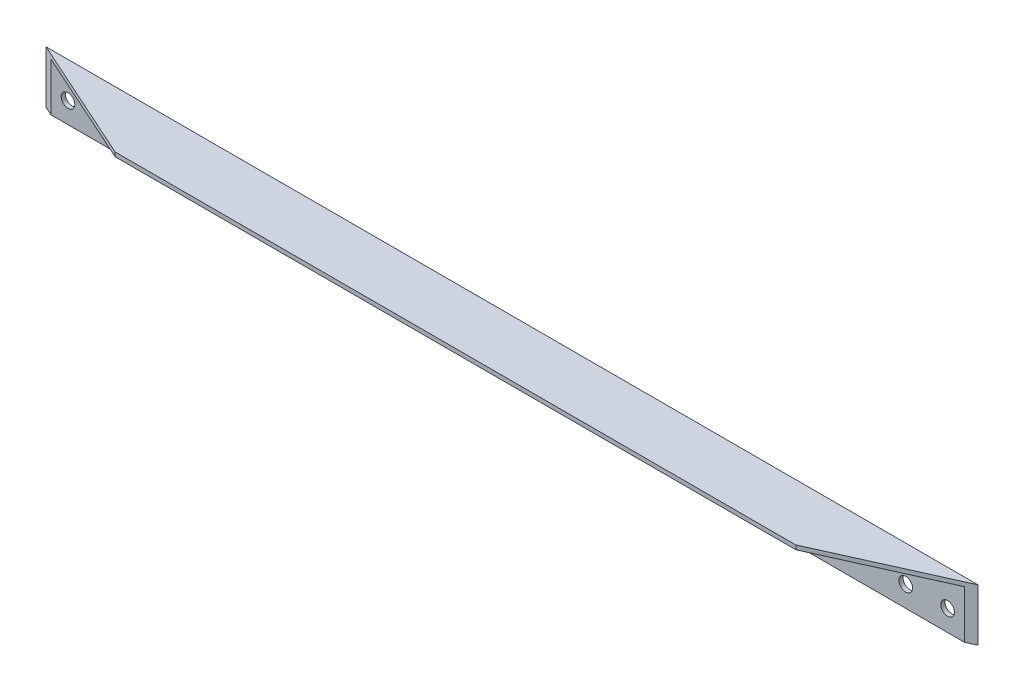
ISO-10303-21;
HEADER;
FILE_DESCRIPTION(('STEP AP214'),'2;1');
FILE_NAME('part.step','',(''),(''),'','','');
FILE_SCHEMA(('AUTOMOTIVE_DESIGN { 1 0 10303 214 1 1 1 1 }'));
ENDSEC;
DATA;
#1=APPLICATION_CONTEXT('core data for automotive mechanical design processes');
#2=APPLICATION_PROTOCOL_DEFINITION('international standard','automotive_design',2000,#1);
#3=PRODUCT_CONTEXT('',#1,'mechanical');
#4=PRODUCT('Part','Part','',(#3));
#5=PRODUCT_RELATED_PRODUCT_CATEGORY('part','',(#4));
#6=PRODUCT_DEFINITION_FORMATION('','',#4);
#7=PRODUCT_DEFINITION_CONTEXT('part definition',#1,'design');
#8=PRODUCT_DEFINITION('design','',#6,#7);
#9=PRODUCT_DEFINITION_SHAPE('','',#8);
#10=(LENGTH_UNIT() NAMED_UNIT(*) SI_UNIT(.MILLI.,.METRE.));
#11=(NAMED_UNIT(*) PLANE_ANGLE_UNIT() SI_UNIT($,.RADIAN.));
#12=(NAMED_UNIT(*) SI_UNIT($,.STERADIAN.) SOLID_ANGLE_UNIT());
#13=UNCERTAINTY_MEASURE_WITH_UNIT(LENGTH_MEASURE(1.E-05),#10,'distance_accuracy_value','');
#14=(GEOMETRIC_REPRESENTATION_CONTEXT(3) GLOBAL_UNCERTAINTY_ASSIGNED_CONTEXT((#13)) GLOBAL_UNIT_ASSIGNED_CONTEXT((#10,
#11,#12)) REPRESENTATION_CONTEXT('',''));
#15=CARTESIAN_POINT('',(0.,0.,0.));
#16=DIRECTION('',(0.,0.,1.));
#17=DIRECTION('',(1.,0.,0.));
#18=AXIS2_PLACEMENT_3D('',#15,#16,#17);
#19=CARTESIAN_POINT('',(-890.,100.,8.));
#20=DIRECTION('',(0.,0.,-1.));
#21=DIRECTION('',(-1.,0.,0.));
#22=AXIS2_PLACEMENT_3D('',#19,#20,#21);
#23=PLANE('',#22);
#24=CARTESIAN_POINT('',(-760.,39.9999999999999,8.));
#25=DIRECTION('',(0.,0.,1.));
#26=DIRECTION('',(-1.,0.,0.));
#27=AXIS2_PLACEMENT_3D('',#24,#25,#26);
#28=CIRCLE('',#27,12.9999999999998);
#29=CARTESIAN_POINT('',(-773.,39.9999999999999,8.));
#30=VERTEX_POINT('',#29);
#31=EDGE_CURVE('E105',#30,#30,#28,.T.);
#32=ORIENTED_EDGE('',*,*,#31,.F.);
#33=EDGE_LOOP('',(#32));
#34=FACE_BOUND('',#33,.T.);
#35=CARTESIAN_POINT('',(760.,39.9999999999999,8.));
#36=DIRECTION('',(0.,0.,1.));
#37=DIRECTION('',(1.,0.,0.));
#38=AXIS2_PLACEMENT_3D('',#35,#36,#37);
#39=CIRCLE('',#38,12.9999999999998);
#40=CARTESIAN_POINT('',(773.,39.9999999999999,8.));
#41=VERTEX_POINT('',#40);
#42=EDGE_CURVE('E120',#41,#41,#39,.T.);
#43=ORIENTED_EDGE('',*,*,#42,.F.);
#44=EDGE_LOOP('',(#43));
#45=FACE_BOUND('',#44,.T.);
#46=CARTESIAN_POINT('',(840.,39.9999999999999,8.));
#47=DIRECTION('',(0.,0.,1.));
#48=DIRECTION('',(1.,0.,0.));
#49=AXIS2_PLACEMENT_3D('',#46,#47,#48);
#50=CIRCLE('',#49,12.9999999999998);
#51=CARTESIAN_POINT('',(853.,39.9999999999999,8.));
#52=VERTEX_POINT('',#51);
#53=EDGE_CURVE('E126',#52,#52,#50,.T.);
#54=ORIENTED_EDGE('',*,*,#53,.F.);
#55=EDGE_LOOP('',(#54));
#56=FACE_BOUND('',#55,.T.);
#57=CARTESIAN_POINT('',(-840.,39.9999999999999,8.));
#58=DIRECTION('',(0.,0.,1.));
#59=DIRECTION('',(-1.,0.,0.));
#60=AXIS2_PLACEMENT_3D('',#57,#58,#59);
#61=CIRCLE('',#60,12.9999999999998);
#62=CARTESIAN_POINT('',(-853.,39.9999999999999,8.));
#63=VERTEX_POINT('',#62);
#64=EDGE_CURVE('E114',#63,#63,#61,.T.);
#65=ORIENTED_EDGE('',*,*,#64,.F.);
#66=EDGE_LOOP('',(#65));
#67=FACE_BOUND('',#66,.T.);
#68=DIRECTION('',(1.,0.,0.));
#69=VECTOR('',#68,1.);
#70=CARTESIAN_POINT('',(-890.,92.,8.));
#71=LINE('',#70,#69);
#72=CARTESIAN_POINT('',(-872.222222222222,92.,8.));
#73=VERTEX_POINT('',#72);
#74=CARTESIAN_POINT('',(872.222222222222,92.,8.));
#75=VERTEX_POINT('',#74);
#76=EDGE_CURVE('E37',#73,#75,#71,.T.);
#77=ORIENTED_EDGE('',*,*,#76,.F.);
#78=DIRECTION('',(0.,-1.,0.));
#79=VECTOR('',#78,1.);
#80=CARTESIAN_POINT('',(-872.222222222222,100.,8.));
#81=LINE('',#80,#79);
#82=CARTESIAN_POINT('',(-872.222222222222,0.,8.));
#83=VERTEX_POINT('',#82);
#84=EDGE_CURVE('E165',#73,#83,#81,.T.);
#85=ORIENTED_EDGE('',*,*,#84,.T.);
#86=DIRECTION('',(1.,0.,0.));
#87=VECTOR('',#86,1.);
#88=CARTESIAN_POINT('',(-890.,0.,8.));
#89=LINE('',#88,#87);
#90=CARTESIAN_POINT('',(872.222222222222,0.,8.));
#91=VERTEX_POINT('',#90);
#92=EDGE_CURVE('E132',#83,#91,#89,.T.);
#93=ORIENTED_EDGE('',*,*,#92,.T.);
#94=DIRECTION('',(0.,1.,0.));
#95=VECTOR('',#94,1.);
#96=CARTESIAN_POINT('',(872.222222222222,100.,8.));
#97=LINE('',#96,#95);
#98=EDGE_CURVE('E150',#91,#75,#97,.T.);
#99=ORIENTED_EDGE('',*,*,#98,.T.);
#100=EDGE_LOOP('',(#77,#85,#93,#99));
#101=FACE_BOUND('',#100,.T.);
#102=ADVANCED_FACE('F33',(#34,#45,#56,#67,#101),#23,.F.);
#103=CARTESIAN_POINT('',(-890.,100.,0.));
#104=DIRECTION('',(0.,0.,-1.));
#105=DIRECTION('',(-1.,0.,0.));
#106=AXIS2_PLACEMENT_3D('',#103,#104,#105);
#107=PLANE('',#106);
#108=CARTESIAN_POINT('',(-840.,39.9999999999999,0.));
#109=DIRECTION('',(0.,0.,1.));
#110=DIRECTION('',(-1.,0.,0.));
#111=AXIS2_PLACEMENT_3D('',#108,#109,#110);
#112=CIRCLE('',#111,12.9999999999998);
#113=CARTESIAN_POINT('',(-853.,39.9999999999999,0.));
#114=VERTEX_POINT('',#113);
#115=EDGE_CURVE('E112',#114,#114,#112,.T.);
#116=ORIENTED_EDGE('',*,*,#115,.T.);
#117=EDGE_LOOP('',(#116));
#118=FACE_BOUND('',#117,.T.);
#119=CARTESIAN_POINT('',(840.,39.9999999999999,0.));
#120=DIRECTION('',(0.,0.,1.));
#121=DIRECTION('',(1.,0.,0.));
#122=AXIS2_PLACEMENT_3D('',#119,#120,#121);
#123=CIRCLE('',#122,12.9999999999998);
#124=CARTESIAN_POINT('',(853.,39.9999999999999,0.));
#125=VERTEX_POINT('',#124);
#126=EDGE_CURVE('E123',#125,#125,#123,.T.);
#127=ORIENTED_EDGE('',*,*,#126,.T.);
#128=EDGE_LOOP('',(#127));
#129=FACE_BOUND('',#128,.T.);
#130=DIRECTION('',(0.,-1.,0.));
#131=VECTOR('',#130,1.);
#132=CARTESIAN_POINT('',(-890.,0.,0.));
#133=LINE('',#132,#131);
#134=CARTESIAN_POINT('',(-890.,100.,0.));
#135=VERTEX_POINT('',#134);
#136=CARTESIAN_POINT('',(-890.,0.,0.));
#137=VERTEX_POINT('',#136);
#138=EDGE_CURVE('E129',#135,#137,#133,.T.);
#139=ORIENTED_EDGE('',*,*,#138,.F.);
#140=DIRECTION('',(-1.,0.,0.));
#141=VECTOR('',#140,1.);
#142=CARTESIAN_POINT('',(-890.,100.,0.));
#143=LINE('',#142,#141);
#144=CARTESIAN_POINT('',(890.,100.,0.));
#145=VERTEX_POINT('',#144);
#146=EDGE_CURVE('E97',#145,#135,#143,.T.);
#147=ORIENTED_EDGE('',*,*,#146,.F.);
#148=DIRECTION('',(0.,1.,0.));
#149=VECTOR('',#148,1.);
#150=CARTESIAN_POINT('',(890.,0.,0.));
#151=LINE('',#150,#149);
#152=CARTESIAN_POINT('',(890.,0.,0.));
#153=VERTEX_POINT('',#152);
#154=EDGE_CURVE('E138',#153,#145,#151,.T.);
#155=ORIENTED_EDGE('',*,*,#154,.F.);
#156=DIRECTION('',(1.,0.,0.));
#157=VECTOR('',#156,1.);
#158=CARTESIAN_POINT('',(-890.,0.,0.));
#159=LINE('',#158,#157);
#160=EDGE_CURVE('E135',#137,#153,#159,.T.);
#161=ORIENTED_EDGE('',*,*,#160,.F.);
#162=EDGE_LOOP('',(#139,#147,#155,#161));
#163=FACE_BOUND('',#162,.T.);
#164=CARTESIAN_POINT('',(760.,39.9999999999999,0.));
#165=DIRECTION('',(0.,0.,1.));
#166=DIRECTION('',(1.,0.,0.));
#167=AXIS2_PLACEMENT_3D('',#164,#165,#166);
#168=CIRCLE('',#167,12.9999999999998);
#169=CARTESIAN_POINT('',(773.,39.9999999999999,0.));
#170=VERTEX_POINT('',#169);
#171=EDGE_CURVE('E117',#170,#170,#168,.T.);
#172=ORIENTED_EDGE('',*,*,#171,.T.);
#173=EDGE_LOOP('',(#172));
#174=FACE_BOUND('',#173,.T.);
#175=CARTESIAN_POINT('',(-760.,39.9999999999999,0.));
#176=DIRECTION('',(0.,0.,1.));
#177=DIRECTION('',(-1.,0.,0.));
#178=AXIS2_PLACEMENT_3D('',#175,#176,#177);
#179=CIRCLE('',#178,12.9999999999998);
#180=CARTESIAN_POINT('',(-773.,39.9999999999999,0.));
#181=VERTEX_POINT('',#180);
#182=EDGE_CURVE('E101',#181,#181,#179,.T.);
#183=ORIENTED_EDGE('',*,*,#182,.T.);
#184=EDGE_LOOP('',(#183));
#185=FACE_BOUND('',#184,.T.);
#186=ADVANCED_FACE('F169',(#118,#129,#163,#174,#185),#107,.T.);
#187=CARTESIAN_POINT('',(-890.,0.,8.));
#188=DIRECTION('',(0.,1.,0.));
#189=DIRECTION('',(0.,0.,1.));
#190=AXIS2_PLACEMENT_3D('',#187,#188,#189);
#191=PLANE('',#190);
#192=ORIENTED_EDGE('',*,*,#92,.F.);
#193=DIRECTION('',(-0.911921505175107,0.,-0.410364677328798));
#194=VECTOR('',#193,1.);
#195=CARTESIAN_POINT('',(-887.006237006237,0.,1.34719334719335));
#196=LINE('',#195,#194);
#197=EDGE_CURVE('E154',#83,#137,#196,.T.);
#198=ORIENTED_EDGE('',*,*,#197,.T.);
#199=ORIENTED_EDGE('',*,*,#160,.T.);
#200=DIRECTION('',(-0.911921505175107,0.,0.410364677328798));
#201=VECTOR('',#200,1.);
#202=CARTESIAN_POINT('',(-593.243243243243,0.,667.459459459459));
#203=LINE('',#202,#201);
#204=EDGE_CURVE('E152',#153,#91,#203,.T.);
#205=ORIENTED_EDGE('',*,*,#204,.T.);
#206=EDGE_LOOP('',(#192,#198,#199,#205));
#207=FACE_BOUND('',#206,.T.);
#208=ADVANCED_FACE('F35',(#207),#191,.F.);
#209=CARTESIAN_POINT('',(-890.,100.,8.));
#210=DIRECTION('',(0.,-1.,0.));
#211=DIRECTION('',(0.,0.,-1.));
#212=AXIS2_PLACEMENT_3D('',#209,#210,#211);
#213=PLANE('',#212);
#214=ORIENTED_EDGE('',*,*,#146,.T.);
#215=DIRECTION('',(-0.911921505175107,0.,-0.410364677328798));
#216=VECTOR('',#215,1.);
#217=CARTESIAN_POINT('',(-650.,100.,108.));
#218=LINE('',#217,#216);
#219=CARTESIAN_POINT('',(-650.,100.,108.));
#220=VERTEX_POINT('',#219);
#221=EDGE_CURVE('E87',#220,#135,#218,.T.);
#222=ORIENTED_EDGE('',*,*,#221,.F.);
#223=DIRECTION('',(-1.,0.,0.));
#224=VECTOR('',#223,1.);
#225=CARTESIAN_POINT('',(-890.,100.,108.));
#226=LINE('',#225,#224);
#227=CARTESIAN_POINT('',(650.,100.,108.));
#228=VERTEX_POINT('',#227);
#229=EDGE_CURVE('E95',#228,#220,#226,.T.);
#230=ORIENTED_EDGE('',*,*,#229,.F.);
#231=DIRECTION('',(-0.911921505175107,0.,0.410364677328798));
#232=VECTOR('',#231,1.);
#233=CARTESIAN_POINT('',(650.,100.,108.));
#234=LINE('',#233,#232);
#235=EDGE_CURVE('E57',#145,#228,#234,.T.);
#236=ORIENTED_EDGE('',*,*,#235,.F.);
#237=EDGE_LOOP('',(#214,#222,#230,#236));
#238=FACE_BOUND('',#237,.T.);
#239=ADVANCED_FACE('F94',(#238),#213,.F.);
#240=CARTESIAN_POINT('',(840.,39.9999999999999,8.));
#241=DIRECTION('',(0.,0.,-1.));
#242=DIRECTION('',(-1.,0.,0.));
#243=AXIS2_PLACEMENT_3D('',#240,#241,#242);
#244=CYLINDRICAL_SURFACE('',#243,12.9999999999998);
#245=ORIENTED_EDGE('',*,*,#53,.T.);
#246=EDGE_LOOP('',(#245));
#247=FACE_BOUND('',#246,.T.);
#248=ORIENTED_EDGE('',*,*,#126,.F.);
#249=EDGE_LOOP('',(#248));
#250=FACE_BOUND('',#249,.T.);
#251=ADVANCED_FACE('F199',(#247,#250),#244,.F.);
#252=CARTESIAN_POINT('',(760.,39.9999999999999,8.));
#253=DIRECTION('',(0.,0.,-1.));
#254=DIRECTION('',(-1.,0.,0.));
#255=AXIS2_PLACEMENT_3D('',#252,#253,#254);
#256=CYLINDRICAL_SURFACE('',#255,12.9999999999998);
#257=ORIENTED_EDGE('',*,*,#42,.T.);
#258=EDGE_LOOP('',(#257));
#259=FACE_BOUND('',#258,.T.);
#260=ORIENTED_EDGE('',*,*,#171,.F.);
#261=EDGE_LOOP('',(#260));
#262=FACE_BOUND('',#261,.T.);
#263=ADVANCED_FACE('F188',(#259,#262),#256,.F.);
#264=CARTESIAN_POINT('',(-840.,39.9999999999999,8.));
#265=DIRECTION('',(0.,0.,-1.));
#266=DIRECTION('',(-1.,0.,0.));
#267=AXIS2_PLACEMENT_3D('',#264,#265,#266);
#268=CYLINDRICAL_SURFACE('',#267,12.9999999999998);
#269=ORIENTED_EDGE('',*,*,#64,.T.);
#270=EDGE_LOOP('',(#269));
#271=FACE_BOUND('',#270,.T.);
#272=ORIENTED_EDGE('',*,*,#115,.F.);
#273=EDGE_LOOP('',(#272));
#274=FACE_BOUND('',#273,.T.);
#275=ADVANCED_FACE('F180',(#271,#274),#268,.F.);
#276=CARTESIAN_POINT('',(-760.,39.9999999999999,8.));
#277=DIRECTION('',(0.,0.,-1.));
#278=DIRECTION('',(-1.,0.,0.));
#279=AXIS2_PLACEMENT_3D('',#276,#277,#278);
#280=CYLINDRICAL_SURFACE('',#279,12.9999999999998);
#281=ORIENTED_EDGE('',*,*,#31,.T.);
#282=EDGE_LOOP('',(#281));
#283=FACE_BOUND('',#282,.T.);
#284=ORIENTED_EDGE('',*,*,#182,.F.);
#285=EDGE_LOOP('',(#284));
#286=FACE_BOUND('',#285,.T.);
#287=ADVANCED_FACE('F178',(#283,#286),#280,.F.);
#288=CARTESIAN_POINT('',(-890.,92.,108.));
#289=DIRECTION('',(0.,1.,0.));
#290=DIRECTION('',(0.,0.,1.));
#291=AXIS2_PLACEMENT_3D('',#288,#289,#290);
#292=PLANE('',#291);
#293=DIRECTION('',(1.,0.,0.));
#294=VECTOR('',#293,1.);
#295=CARTESIAN_POINT('',(-890.,92.,108.));
#296=LINE('',#295,#294);
#297=CARTESIAN_POINT('',(-650.,92.,108.));
#298=VERTEX_POINT('',#297);
#299=CARTESIAN_POINT('',(650.,92.,108.));
#300=VERTEX_POINT('',#299);
#301=EDGE_CURVE('E102',#298,#300,#296,.T.);
#302=ORIENTED_EDGE('',*,*,#301,.F.);
#303=DIRECTION('',(-0.911921505175107,0.,-0.410364677328798));
#304=VECTOR('',#303,1.);
#305=CARTESIAN_POINT('',(-849.5841995842,92.,18.1871101871102));
#306=LINE('',#305,#304);
#307=EDGE_CURVE('E49',#298,#73,#306,.T.);
#308=ORIENTED_EDGE('',*,*,#307,.T.);
#309=ORIENTED_EDGE('',*,*,#76,.T.);
#310=DIRECTION('',(-0.911921505175107,0.,0.410364677328798));
#311=VECTOR('',#310,1.);
#312=CARTESIAN_POINT('',(-630.665280665281,92.,684.299376299376));
#313=LINE('',#312,#311);
#314=EDGE_CURVE('E145',#75,#300,#313,.T.);
#315=ORIENTED_EDGE('',*,*,#314,.T.);
#316=EDGE_LOOP('',(#302,#308,#309,#315));
#317=FACE_BOUND('',#316,.T.);
#318=ADVANCED_FACE('F148',(#317),#292,.F.);
#319=CARTESIAN_POINT('',(-890.,92.,108.));
#320=DIRECTION('',(0.,0.,1.));
#321=DIRECTION('',(1.,0.,0.));
#322=AXIS2_PLACEMENT_3D('',#319,#320,#321);
#323=PLANE('',#322);
#324=DIRECTION('',(0.,1.,0.));
#325=VECTOR('',#324,1.);
#326=CARTESIAN_POINT('',(-650.,92.,108.));
#327=LINE('',#326,#325);
#328=EDGE_CURVE('E11',#298,#220,#327,.T.);
#329=ORIENTED_EDGE('',*,*,#328,.F.);
#330=ORIENTED_EDGE('',*,*,#301,.T.);
#331=DIRECTION('',(0.,-1.,0.));
#332=VECTOR('',#331,1.);
#333=CARTESIAN_POINT('',(650.,92.,108.));
#334=LINE('',#333,#332);
#335=EDGE_CURVE('E43',#228,#300,#334,.T.);
#336=ORIENTED_EDGE('',*,*,#335,.F.);
#337=ORIENTED_EDGE('',*,*,#229,.T.);
#338=EDGE_LOOP('',(#329,#330,#336,#337));
#339=FACE_BOUND('',#338,.T.);
#340=ADVANCED_FACE('F100',(#339),#323,.T.);
#341=CARTESIAN_POINT('',(650.,-2.50000000007189E-05,108.));
#342=DIRECTION('',(-0.410364677328798,0.,-0.911921505175107));
#343=DIRECTION('',(-0.911921505175107,0.,0.410364677328798));
#344=AXIS2_PLACEMENT_3D('',#341,#342,#343);
#345=PLANE('',#344);
#346=ORIENTED_EDGE('',*,*,#154,.T.);
#347=ORIENTED_EDGE('',*,*,#235,.T.);
#348=ORIENTED_EDGE('',*,*,#335,.T.);
#349=ORIENTED_EDGE('',*,*,#314,.F.);
#350=ORIENTED_EDGE('',*,*,#98,.F.);
#351=ORIENTED_EDGE('',*,*,#204,.F.);
#352=EDGE_LOOP('',(#346,#347,#348,#349,#350,#351));
#353=FACE_BOUND('',#352,.T.);
#354=ADVANCED_FACE('F143',(#353),#345,.F.);
#355=CARTESIAN_POINT('',(-650.,-2.50000000007189E-05,108.));
#356=DIRECTION('',(0.410364677328798,0.,-0.911921505175107));
#357=DIRECTION('',(-0.911921505175107,0.,-0.410364677328798));
#358=AXIS2_PLACEMENT_3D('',#355,#356,#357);
#359=PLANE('',#358);
#360=ORIENTED_EDGE('',*,*,#84,.F.);
#361=ORIENTED_EDGE('',*,*,#307,.F.);
#362=ORIENTED_EDGE('',*,*,#328,.T.);
#363=ORIENTED_EDGE('',*,*,#221,.T.);
#364=ORIENTED_EDGE('',*,*,#138,.T.);
#365=ORIENTED_EDGE('',*,*,#197,.F.);
#366=EDGE_LOOP('',(#360,#361,#362,#363,#364,#365));
#367=FACE_BOUND('',#366,.T.);
#368=ADVANCED_FACE('F86',(#367),#359,.F.);
#369=CLOSED_SHELL('',(#102,#186,#208,#239,#251,#263,#275,#287,#318,#340,#354,#368));
#370=MANIFOLD_SOLID_BREP('B2',#369);
#371=ADVANCED_BREP_SHAPE_REPRESENTATION('',(#18,#370),#14);
#372=SHAPE_DEFINITION_REPRESENTATION(#9,#371);
ENDSEC;
END-ISO-10303-21;
